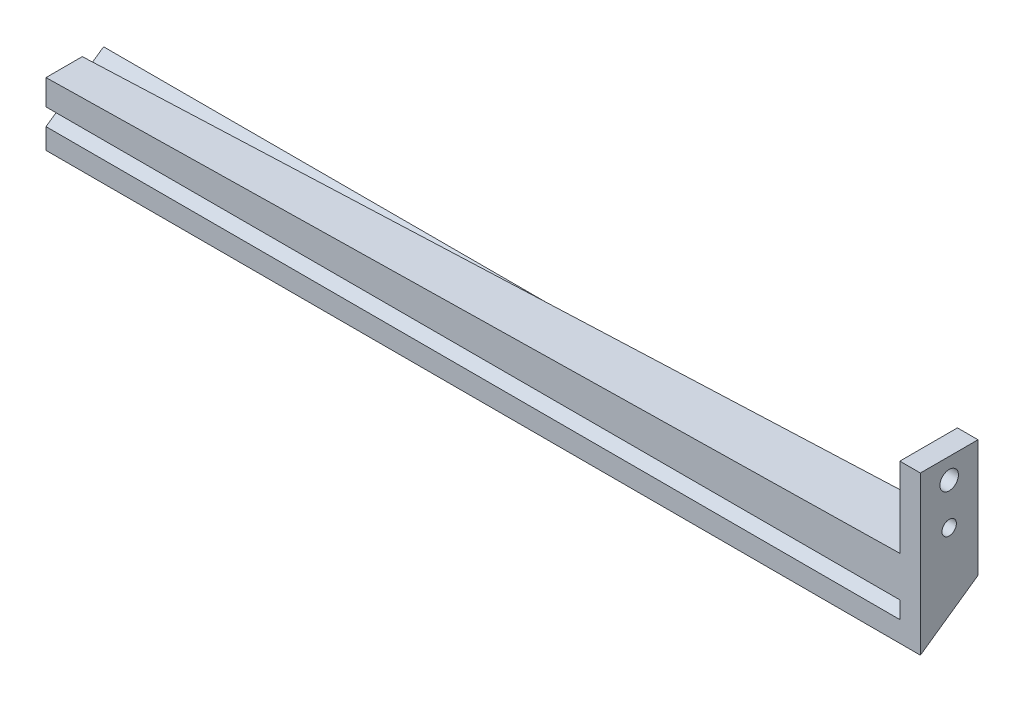
ISO-10303-21;
HEADER;
FILE_DESCRIPTION(('STEP AP214'),'2;1');
FILE_NAME('part.step','',(''),(''),'','','');
FILE_SCHEMA(('AUTOMOTIVE_DESIGN { 1 0 10303 214 1 1 1 1 }'));
ENDSEC;
DATA;
#1=APPLICATION_CONTEXT('core data for automotive mechanical design processes');
#2=APPLICATION_PROTOCOL_DEFINITION('international standard','automotive_design',2000,#1);
#3=PRODUCT_CONTEXT('',#1,'mechanical');
#4=PRODUCT('Part','Part','',(#3));
#5=PRODUCT_RELATED_PRODUCT_CATEGORY('part','',(#4));
#6=PRODUCT_DEFINITION_FORMATION('','',#4);
#7=PRODUCT_DEFINITION_CONTEXT('part definition',#1,'design');
#8=PRODUCT_DEFINITION('design','',#6,#7);
#9=PRODUCT_DEFINITION_SHAPE('','',#8);
#10=(LENGTH_UNIT() NAMED_UNIT(*) SI_UNIT(.MILLI.,.METRE.));
#11=(NAMED_UNIT(*) PLANE_ANGLE_UNIT() SI_UNIT($,.RADIAN.));
#12=(NAMED_UNIT(*) SI_UNIT($,.STERADIAN.) SOLID_ANGLE_UNIT());
#13=UNCERTAINTY_MEASURE_WITH_UNIT(LENGTH_MEASURE(1.E-05),#10,'distance_accuracy_value','');
#14=(GEOMETRIC_REPRESENTATION_CONTEXT(3) GLOBAL_UNCERTAINTY_ASSIGNED_CONTEXT((#13)) GLOBAL_UNIT_ASSIGNED_CONTEXT((#10,
#11,#12)) REPRESENTATION_CONTEXT('',''));
#15=CARTESIAN_POINT('',(0.,0.,0.));
#16=DIRECTION('',(0.,0.,1.));
#17=DIRECTION('',(1.,0.,0.));
#18=AXIS2_PLACEMENT_3D('',#15,#16,#17);
#19=CARTESIAN_POINT('',(0.,0.,0.));
#20=DIRECTION('',(-1.,0.,0.));
#21=DIRECTION('',(0.,0.,1.));
#22=AXIS2_PLACEMENT_3D('',#19,#20,#21);
#23=PLANE('',#22);
#24=DIRECTION('',(0.,-0.573576436351045,0.819152044288993));
#25=VECTOR('',#24,1.);
#26=CARTESIAN_POINT('',(0.,201.856859380682,-281.606099271407));
#27=LINE('',#26,#25);
#28=CARTESIAN_POINT('',(0.,-4.68858336291679,13.3713630845313));
#29=VERTEX_POINT('',#28);
#30=CARTESIAN_POINT('',(0.,-17.0389236561578,31.0094769569105));
#31=VERTEX_POINT('',#30);
#32=EDGE_CURVE('E61',#29,#31,#27,.T.);
#33=ORIENTED_EDGE('',*,*,#32,.T.);
#34=DIRECTION('',(0.,-1.,0.));
#35=VECTOR('',#34,1.);
#36=CARTESIAN_POINT('',(0.,-35.3505424875797,31.0094769569105));
#37=LINE('',#36,#35);
#38=CARTESIAN_POINT('',(0.,-4.68858336291679,31.0094769569105));
#39=VERTEX_POINT('',#38);
#40=EDGE_CURVE('E145',#39,#31,#37,.T.);
#41=ORIENTED_EDGE('',*,*,#40,.F.);
#42=DIRECTION('',(0.,0.,1.));
#43=VECTOR('',#42,1.);
#44=CARTESIAN_POINT('',(0.,-4.68858336291679,0.));
#45=LINE('',#44,#43);
#46=EDGE_CURVE('E11',#29,#39,#45,.T.);
#47=ORIENTED_EDGE('',*,*,#46,.F.);
#48=EDGE_LOOP('',(#33,#41,#47));
#49=FACE_BOUND('',#48,.T.);
#50=ADVANCED_FACE('F43',(#49),#23,.T.);
#51=CARTESIAN_POINT('',(425.,-35.3505424875797,31.0094769569105));
#52=DIRECTION('',(0.,0.,-1.));
#53=DIRECTION('',(0.,1.,0.));
#54=AXIS2_PLACEMENT_3D('',#51,#52,#53);
#55=PLANE('',#54);
#56=ORIENTED_EDGE('',*,*,#40,.T.);
#57=DIRECTION('',(1.,0.,0.));
#58=VECTOR('',#57,1.);
#59=CARTESIAN_POINT('',(-0.000999999999973245,-17.0389236561578,31.0094769569105));
#60=LINE('',#59,#58);
#61=CARTESIAN_POINT('',(415.,-17.0389236561578,31.0094769569105));
#62=VERTEX_POINT('',#61);
#63=EDGE_CURVE('E126',#31,#62,#60,.T.);
#64=ORIENTED_EDGE('',*,*,#63,.T.);
#65=DIRECTION('',(0.,-1.,0.));
#66=VECTOR('',#65,1.);
#67=CARTESIAN_POINT('',(415.,41.3552685822921,31.0094769569105));
#68=LINE('',#67,#66);
#69=CARTESIAN_POINT('',(415.,-25.3401908597358,31.0094769569106));
#70=VERTEX_POINT('',#69);
#71=EDGE_CURVE('E131',#62,#70,#68,.T.);
#72=ORIENTED_EDGE('',*,*,#71,.T.);
#73=DIRECTION('',(1.,0.,0.));
#74=VECTOR('',#73,1.);
#75=CARTESIAN_POINT('',(-0.000999999999973245,-25.3401908597358,31.0094769569106));
#76=LINE('',#75,#74);
#77=CARTESIAN_POINT('',(0.,-25.3401908597358,31.0094769569106));
#78=VERTEX_POINT('',#77);
#79=EDGE_CURVE('E147',#78,#70,#76,.T.);
#80=ORIENTED_EDGE('',*,*,#79,.F.);
#81=CARTESIAN_POINT('',(0.,-35.3505424875797,31.0094769569105));
#82=VERTEX_POINT('',#81);
#83=EDGE_CURVE('E183',#78,#82,#37,.T.);
#84=ORIENTED_EDGE('',*,*,#83,.T.);
#85=DIRECTION('',(-1.,0.,0.));
#86=VECTOR('',#85,1.);
#87=CARTESIAN_POINT('',(425.,-35.3505424875797,31.0094769569105));
#88=LINE('',#87,#86);
#89=CARTESIAN_POINT('',(425.,-35.3505424875797,31.0094769569105));
#90=VERTEX_POINT('',#89);
#91=EDGE_CURVE('E53',#90,#82,#88,.T.);
#92=ORIENTED_EDGE('',*,*,#91,.F.);
#93=DIRECTION('',(0.,-1.,0.));
#94=VECTOR('',#93,1.);
#95=CARTESIAN_POINT('',(425.,-35.3505424875797,31.0094769569105));
#96=LINE('',#95,#94);
#97=CARTESIAN_POINT('',(425.,41.3552685822921,31.0094769569105));
#98=VERTEX_POINT('',#97);
#99=EDGE_CURVE('E184',#98,#90,#96,.T.);
#100=ORIENTED_EDGE('',*,*,#99,.F.);
#101=DIRECTION('',(-1.,0.,0.));
#102=VECTOR('',#101,1.);
#103=CARTESIAN_POINT('',(425.,41.3552685822921,31.0094769569105));
#104=LINE('',#103,#102);
#105=CARTESIAN_POINT('',(415.,41.3552685822921,31.0094769569105));
#106=VERTEX_POINT('',#105);
#107=EDGE_CURVE('E195',#98,#106,#104,.T.);
#108=ORIENTED_EDGE('',*,*,#107,.T.);
#109=DIRECTION('',(0.,1.,0.));
#110=VECTOR('',#109,1.);
#111=CARTESIAN_POINT('',(415.,41.3552685822921,31.0094769569105));
#112=LINE('',#111,#110);
#113=CARTESIAN_POINT('',(415.,2.55526858229212,31.0094769569105));
#114=VERTEX_POINT('',#113);
#115=EDGE_CURVE('E169',#114,#106,#112,.T.);
#116=ORIENTED_EDGE('',*,*,#115,.F.);
#117=DIRECTION('',(0.999847695156391,0.0174524064372802,0.));
#118=VECTOR('',#117,1.);
#119=CARTESIAN_POINT('',(415.,2.55526858229212,31.0094769569105));
#120=LINE('',#119,#118);
#121=EDGE_CURVE('E165',#39,#114,#120,.T.);
#122=ORIENTED_EDGE('',*,*,#121,.F.);
#123=EDGE_LOOP('',(#56,#64,#72,#80,#84,#92,#100,#108,#116,#122));
#124=FACE_BOUND('',#123,.T.);
#125=ADVANCED_FACE('F45',(#124),#55,.F.);
#126=CARTESIAN_POINT('',(425.,-15.7447314177079,3.0094769569105));
#127=DIRECTION('',(0.,0.819152044288993,0.573576436351045));
#128=DIRECTION('',(0.,-0.573576436351045,0.819152044288993));
#129=AXIS2_PLACEMENT_3D('',#126,#127,#128);
#130=PLANE('',#129);
#131=DIRECTION('',(0.,0.573576436351045,-0.819152044288993));
#132=VECTOR('',#131,1.);
#133=CARTESIAN_POINT('',(0.,-15.7447314177079,3.0094769569105));
#134=LINE('',#133,#132);
#135=CARTESIAN_POINT('',(0.,-15.7447314177079,3.0094769569105));
#136=VERTEX_POINT('',#135);
#137=EDGE_CURVE('E86',#82,#136,#134,.T.);
#138=ORIENTED_EDGE('',*,*,#137,.T.);
#139=DIRECTION('',(-1.,0.,0.));
#140=VECTOR('',#139,1.);
#141=CARTESIAN_POINT('',(425.,-15.7447314177079,3.0094769569105));
#142=LINE('',#141,#140);
#143=CARTESIAN_POINT('',(425.,-15.7447314177079,3.0094769569105));
#144=VERTEX_POINT('',#143);
#145=EDGE_CURVE('E210',#144,#136,#142,.T.);
#146=ORIENTED_EDGE('',*,*,#145,.F.);
#147=DIRECTION('',(0.,0.573576436351045,-0.819152044288993));
#148=VECTOR('',#147,1.);
#149=CARTESIAN_POINT('',(425.,-15.7447314177079,3.0094769569105));
#150=LINE('',#149,#148);
#151=EDGE_CURVE('E91',#90,#144,#150,.T.);
#152=ORIENTED_EDGE('',*,*,#151,.F.);
#153=ORIENTED_EDGE('',*,*,#91,.T.);
#154=EDGE_LOOP('',(#138,#146,#152,#153));
#155=FACE_BOUND('',#154,.T.);
#156=ADVANCED_FACE('F244',(#155),#130,.F.);
#157=CARTESIAN_POINT('',(425.,41.3552685822921,3.0094769569105));
#158=DIRECTION('',(0.,0.,1.));
#159=DIRECTION('',(0.,-1.,0.));
#160=AXIS2_PLACEMENT_3D('',#157,#158,#159);
#161=PLANE('',#160);
#162=DIRECTION('',(1.,0.,0.));
#163=VECTOR('',#162,1.);
#164=CARTESIAN_POINT('',(-0.000999999999973245,-5.73437978986399,3.00947695691051));
#165=LINE('',#164,#163);
#166=CARTESIAN_POINT('',(0.,-5.73437978986399,3.00947695691051));
#167=VERTEX_POINT('',#166);
#168=CARTESIAN_POINT('',(415.,-5.73437978986399,3.00947695691051));
#169=VERTEX_POINT('',#168);
#170=EDGE_CURVE('E151',#167,#169,#165,.T.);
#171=ORIENTED_EDGE('',*,*,#170,.T.);
#172=DIRECTION('',(0.,1.,0.));
#173=VECTOR('',#172,1.);
#174=CARTESIAN_POINT('',(415.,41.3552685822921,3.0094769569105));
#175=LINE('',#174,#173);
#176=CARTESIAN_POINT('',(415.,41.3552685822921,3.00947695691051));
#177=VERTEX_POINT('',#176);
#178=EDGE_CURVE('E177',#169,#177,#175,.T.);
#179=ORIENTED_EDGE('',*,*,#178,.T.);
#180=DIRECTION('',(-1.,0.,0.));
#181=VECTOR('',#180,1.);
#182=CARTESIAN_POINT('',(425.,41.3552685822921,3.0094769569105));
#183=LINE('',#182,#181);
#184=CARTESIAN_POINT('',(425.,41.3552685822921,3.0094769569105));
#185=VERTEX_POINT('',#184);
#186=EDGE_CURVE('E206',#185,#177,#183,.T.);
#187=ORIENTED_EDGE('',*,*,#186,.F.);
#188=DIRECTION('',(0.,1.,0.));
#189=VECTOR('',#188,1.);
#190=CARTESIAN_POINT('',(425.,41.3552685822921,3.0094769569105));
#191=LINE('',#190,#189);
#192=EDGE_CURVE('E190',#144,#185,#191,.T.);
#193=ORIENTED_EDGE('',*,*,#192,.F.);
#194=ORIENTED_EDGE('',*,*,#145,.T.);
#195=DIRECTION('',(0.,1.,0.));
#196=VECTOR('',#195,1.);
#197=CARTESIAN_POINT('',(0.,41.3552685822921,3.0094769569105));
#198=LINE('',#197,#196);
#199=EDGE_CURVE('E187',#136,#167,#198,.T.);
#200=ORIENTED_EDGE('',*,*,#199,.T.);
#201=EDGE_LOOP('',(#171,#179,#187,#193,#194,#200));
#202=FACE_BOUND('',#201,.T.);
#203=ADVANCED_FACE('F266',(#202),#161,.F.);
#204=CARTESIAN_POINT('',(425.,41.3552685822921,31.0094769569105));
#205=DIRECTION('',(0.,-1.,0.));
#206=DIRECTION('',(0.,0.,-1.));
#207=AXIS2_PLACEMENT_3D('',#204,#205,#206);
#208=PLANE('',#207);
#209=ORIENTED_EDGE('',*,*,#186,.T.);
#210=DIRECTION('',(0.,0.,1.));
#211=VECTOR('',#210,1.);
#212=CARTESIAN_POINT('',(415.,41.3552685822921,-393.99052304309));
#213=LINE('',#212,#211);
#214=EDGE_CURVE('E173',#177,#106,#213,.T.);
#215=ORIENTED_EDGE('',*,*,#214,.T.);
#216=ORIENTED_EDGE('',*,*,#107,.F.);
#217=DIRECTION('',(0.,0.,1.));
#218=VECTOR('',#217,1.);
#219=CARTESIAN_POINT('',(425.,41.3552685822921,31.0094769569105));
#220=LINE('',#219,#218);
#221=EDGE_CURVE('E70',#185,#98,#220,.T.);
#222=ORIENTED_EDGE('',*,*,#221,.F.);
#223=EDGE_LOOP('',(#209,#215,#216,#222));
#224=FACE_BOUND('',#223,.T.);
#225=ADVANCED_FACE('F255',(#224),#208,.F.);
#226=CARTESIAN_POINT('',(425.,0.,0.));
#227=DIRECTION('',(-1.,0.,0.));
#228=DIRECTION('',(0.,0.,1.));
#229=AXIS2_PLACEMENT_3D('',#226,#227,#228);
#230=PLANE('',#229);
#231=CARTESIAN_POINT('',(425.,31.3552685822921,17.0094769569105));
#232=DIRECTION('',(1.,0.,0.));
#233=DIRECTION('',(0.,0.,-1.));
#234=AXIS2_PLACEMENT_3D('',#231,#232,#233);
#235=CIRCLE('',#234,4.5);
#236=CARTESIAN_POINT('',(425.,31.3552685822921,12.5094769569105));
#237=VERTEX_POINT('',#236);
#238=EDGE_CURVE('E156',#237,#237,#235,.T.);
#239=ORIENTED_EDGE('',*,*,#238,.F.);
#240=EDGE_LOOP('',(#239));
#241=FACE_BOUND('',#240,.T.);
#242=CARTESIAN_POINT('',(425.,11.3552685822921,17.0094769569105));
#243=DIRECTION('',(1.,0.,0.));
#244=DIRECTION('',(0.,0.,-1.));
#245=AXIS2_PLACEMENT_3D('',#242,#243,#244);
#246=CIRCLE('',#245,3.5);
#247=CARTESIAN_POINT('',(425.,11.3552685822921,13.5094769569105));
#248=VERTEX_POINT('',#247);
#249=EDGE_CURVE('E161',#248,#248,#246,.T.);
#250=ORIENTED_EDGE('',*,*,#249,.F.);
#251=EDGE_LOOP('',(#250));
#252=FACE_BOUND('',#251,.T.);
#253=ORIENTED_EDGE('',*,*,#99,.T.);
#254=ORIENTED_EDGE('',*,*,#151,.T.);
#255=ORIENTED_EDGE('',*,*,#192,.T.);
#256=ORIENTED_EDGE('',*,*,#221,.T.);
#257=EDGE_LOOP('',(#253,#254,#255,#256));
#258=FACE_BOUND('',#257,.T.);
#259=ADVANCED_FACE('F248',(#241,#252,#258),#230,.F.);
#260=DIRECTION('',(0.,0.573576436351045,-0.819152044288993));
#261=VECTOR('',#260,1.);
#262=CARTESIAN_POINT('',(0.,196.286625479517,-285.506419038594));
#263=LINE('',#262,#261);
#264=EDGE_CURVE('E260',#78,#167,#263,.T.);
#265=ORIENTED_EDGE('',*,*,#264,.T.);
#266=ORIENTED_EDGE('',*,*,#199,.F.);
#267=ORIENTED_EDGE('',*,*,#137,.F.);
#268=ORIENTED_EDGE('',*,*,#83,.F.);
#269=EDGE_LOOP('',(#265,#266,#267,#268));
#270=FACE_BOUND('',#269,.T.);
#271=ADVANCED_FACE('F240',(#270),#23,.T.);
#272=CARTESIAN_POINT('',(415.,41.3552685822921,-393.99052304309));
#273=DIRECTION('',(1.,0.,0.));
#274=DIRECTION('',(0.,0.,-1.));
#275=AXIS2_PLACEMENT_3D('',#272,#273,#274);
#276=PLANE('',#275);
#277=CARTESIAN_POINT('',(415.,31.3552685822921,17.0094769569105));
#278=DIRECTION('',(1.,0.,0.));
#279=DIRECTION('',(0.,0.,-1.));
#280=AXIS2_PLACEMENT_3D('',#277,#278,#279);
#281=CIRCLE('',#280,4.5);
#282=CARTESIAN_POINT('',(415.,31.3552685822921,12.5094769569105));
#283=VERTEX_POINT('',#282);
#284=EDGE_CURVE('E47',#283,#283,#281,.T.);
#285=ORIENTED_EDGE('',*,*,#284,.T.);
#286=EDGE_LOOP('',(#285));
#287=FACE_BOUND('',#286,.T.);
#288=CARTESIAN_POINT('',(415.,11.3552685822921,17.0094769569105));
#289=DIRECTION('',(1.,0.,0.));
#290=DIRECTION('',(0.,0.,-1.));
#291=AXIS2_PLACEMENT_3D('',#288,#289,#290);
#292=CIRCLE('',#291,3.5);
#293=CARTESIAN_POINT('',(415.,11.3552685822921,13.5094769569105));
#294=VERTEX_POINT('',#293);
#295=EDGE_CURVE('E160',#294,#294,#292,.T.);
#296=ORIENTED_EDGE('',*,*,#295,.T.);
#297=EDGE_LOOP('',(#296));
#298=FACE_BOUND('',#297,.T.);
#299=ORIENTED_EDGE('',*,*,#178,.F.);
#300=DIRECTION('',(0.,0.573576436351045,-0.819152044288993));
#301=VECTOR('',#300,1.);
#302=CARTESIAN_POINT('',(415.,196.286625479517,-285.506419038594));
#303=LINE('',#302,#301);
#304=EDGE_CURVE('E137',#70,#169,#303,.T.);
#305=ORIENTED_EDGE('',*,*,#304,.F.);
#306=ORIENTED_EDGE('',*,*,#71,.F.);
#307=DIRECTION('',(0.,-0.573576436351045,0.819152044288993));
#308=VECTOR('',#307,1.);
#309=CARTESIAN_POINT('',(415.,201.856859380682,-281.606099271407));
#310=LINE('',#309,#308);
#311=CARTESIAN_POINT('',(415.,2.55526858229215,3.02607036784613));
#312=VERTEX_POINT('',#311);
#313=EDGE_CURVE('E122',#312,#62,#310,.T.);
#314=ORIENTED_EDGE('',*,*,#313,.F.);
#315=DIRECTION('',(0.,0.,1.));
#316=VECTOR('',#315,1.);
#317=CARTESIAN_POINT('',(415.,2.55526858229212,-393.99052304309));
#318=LINE('',#317,#316);
#319=EDGE_CURVE('E172',#312,#114,#318,.T.);
#320=ORIENTED_EDGE('',*,*,#319,.T.);
#321=ORIENTED_EDGE('',*,*,#115,.T.);
#322=ORIENTED_EDGE('',*,*,#214,.F.);
#323=EDGE_LOOP('',(#299,#305,#306,#314,#320,#321,#322));
#324=FACE_BOUND('',#323,.T.);
#325=ADVANCED_FACE('F135',(#287,#298,#324),#276,.F.);
#326=CARTESIAN_POINT('',(415.,2.55526858229212,-393.99052304309));
#327=DIRECTION('',(0.0174524064372802,-0.999847695156391,0.));
#328=DIRECTION('',(0.999847695156391,0.0174524064372802,0.));
#329=AXIS2_PLACEMENT_3D('',#326,#327,#328);
#330=PLANE('',#329);
#331=ORIENTED_EDGE('',*,*,#319,.F.);
#332=DIRECTION('',(0.999537268766002,0.0174469879244805,-0.0249168810280006));
#333=VECTOR('',#332,1.);
#334=CARTESIAN_POINT('',(10.9474465729834,-4.49749497218718,13.0984605801993));
#335=LINE('',#334,#333);
#336=EDGE_CURVE('E127',#29,#312,#335,.T.);
#337=ORIENTED_EDGE('',*,*,#336,.F.);
#338=ORIENTED_EDGE('',*,*,#46,.T.);
#339=ORIENTED_EDGE('',*,*,#121,.T.);
#340=EDGE_LOOP('',(#331,#337,#338,#339));
#341=FACE_BOUND('',#340,.T.);
#342=ADVANCED_FACE('F234',(#341),#330,.F.);
#343=CARTESIAN_POINT('',(0.,11.3552685822921,17.0094769569105));
#344=DIRECTION('',(1.,0.,0.));
#345=DIRECTION('',(0.,0.,-1.));
#346=AXIS2_PLACEMENT_3D('',#343,#344,#345);
#347=CYLINDRICAL_SURFACE('',#346,3.5);
#348=ORIENTED_EDGE('',*,*,#249,.T.);
#349=EDGE_LOOP('',(#348));
#350=FACE_BOUND('',#349,.T.);
#351=ORIENTED_EDGE('',*,*,#295,.F.);
#352=EDGE_LOOP('',(#351));
#353=FACE_BOUND('',#352,.T.);
#354=ADVANCED_FACE('F225',(#350,#353),#347,.F.);
#355=CARTESIAN_POINT('',(0.,31.3552685822921,17.0094769569105));
#356=DIRECTION('',(1.,0.,0.));
#357=DIRECTION('',(0.,0.,-1.));
#358=AXIS2_PLACEMENT_3D('',#355,#356,#357);
#359=CYLINDRICAL_SURFACE('',#358,4.5);
#360=ORIENTED_EDGE('',*,*,#238,.T.);
#361=EDGE_LOOP('',(#360));
#362=FACE_BOUND('',#361,.T.);
#363=ORIENTED_EDGE('',*,*,#284,.F.);
#364=EDGE_LOOP('',(#363));
#365=FACE_BOUND('',#364,.T.);
#366=ADVANCED_FACE('F223',(#362,#365),#359,.F.);
#367=CARTESIAN_POINT('',(-0.000999999999973245,201.856859380682,-281.606099271407));
#368=DIRECTION('',(0.,0.819152044288993,0.573576436351045));
#369=DIRECTION('',(0.,-0.573576436351045,0.819152044288993));
#370=AXIS2_PLACEMENT_3D('',#367,#368,#369);
#371=PLANE('',#370);
#372=ORIENTED_EDGE('',*,*,#336,.T.);
#373=ORIENTED_EDGE('',*,*,#313,.T.);
#374=ORIENTED_EDGE('',*,*,#63,.F.);
#375=ORIENTED_EDGE('',*,*,#32,.F.);
#376=EDGE_LOOP('',(#372,#373,#374,#375));
#377=FACE_BOUND('',#376,.T.);
#378=ADVANCED_FACE('F124',(#377),#371,.F.);
#379=CARTESIAN_POINT('',(-0.000999999999973245,196.286625479517,-285.506419038594));
#380=DIRECTION('',(0.,-0.819152044288993,-0.573576436351045));
#381=DIRECTION('',(0.,0.573576436351045,-0.819152044288993));
#382=AXIS2_PLACEMENT_3D('',#379,#380,#381);
#383=PLANE('',#382);
#384=ORIENTED_EDGE('',*,*,#79,.T.);
#385=ORIENTED_EDGE('',*,*,#304,.T.);
#386=ORIENTED_EDGE('',*,*,#170,.F.);
#387=ORIENTED_EDGE('',*,*,#264,.F.);
#388=EDGE_LOOP('',(#384,#385,#386,#387));
#389=FACE_BOUND('',#388,.T.);
#390=ADVANCED_FACE('F232',(#389),#383,.F.);
#391=CLOSED_SHELL('',(#50,#125,#156,#203,#225,#259,#271,#325,#342,#354,#366,#378,#390));
#392=MANIFOLD_SOLID_BREP('B2',#391);
#393=ADVANCED_BREP_SHAPE_REPRESENTATION('',(#18,#392),#14);
#394=SHAPE_DEFINITION_REPRESENTATION(#9,#393);
ENDSEC;
END-ISO-10303-21;
